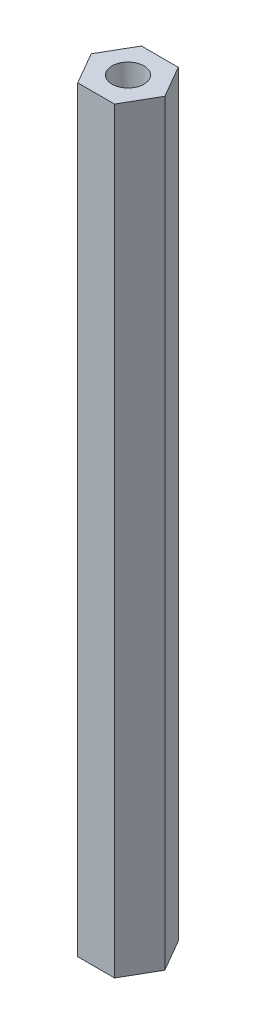
ISO-10303-21;
HEADER;
FILE_DESCRIPTION(('STEP AP214'),'2;1');
FILE_NAME('part.step','',(''),(''),'','','');
FILE_SCHEMA(('AUTOMOTIVE_DESIGN { 1 0 10303 214 1 1 1 1 }'));
ENDSEC;
DATA;
#1=APPLICATION_CONTEXT('core data for automotive mechanical design processes');
#2=APPLICATION_PROTOCOL_DEFINITION('international standard','automotive_design',2000,#1);
#3=PRODUCT_CONTEXT('',#1,'mechanical');
#4=PRODUCT('Part','Part','',(#3));
#5=PRODUCT_RELATED_PRODUCT_CATEGORY('part','',(#4));
#6=PRODUCT_DEFINITION_FORMATION('','',#4);
#7=PRODUCT_DEFINITION_CONTEXT('part definition',#1,'design');
#8=PRODUCT_DEFINITION('design','',#6,#7);
#9=PRODUCT_DEFINITION_SHAPE('','',#8);
#10=(LENGTH_UNIT() NAMED_UNIT(*) SI_UNIT(.MILLI.,.METRE.));
#11=(NAMED_UNIT(*) PLANE_ANGLE_UNIT() SI_UNIT($,.RADIAN.));
#12=(NAMED_UNIT(*) SI_UNIT($,.STERADIAN.) SOLID_ANGLE_UNIT());
#13=UNCERTAINTY_MEASURE_WITH_UNIT(LENGTH_MEASURE(1.E-05),#10,'distance_accuracy_value','');
#14=(GEOMETRIC_REPRESENTATION_CONTEXT(3) GLOBAL_UNCERTAINTY_ASSIGNED_CONTEXT((#13)) GLOBAL_UNIT_ASSIGNED_CONTEXT((#10,
#11,#12)) REPRESENTATION_CONTEXT('',''));
#15=CARTESIAN_POINT('',(0.,0.,0.));
#16=DIRECTION('',(0.,0.,1.));
#17=DIRECTION('',(1.,0.,0.));
#18=AXIS2_PLACEMENT_3D('',#15,#16,#17);
#19=CARTESIAN_POINT('',(4.61880215351701,-47.498,0.));
#20=DIRECTION('',(0.866025403784438,0.,-0.5));
#21=DIRECTION('',(-0.5,0.,-0.866025403784439));
#22=AXIS2_PLACEMENT_3D('',#19,#20,#21);
#23=PLANE('',#22);
#24=DIRECTION('',(0.,1.,0.));
#25=VECTOR('',#24,1.);
#26=CARTESIAN_POINT('',(2.3094010767585,-47.498,-4.));
#27=LINE('',#26,#25);
#28=CARTESIAN_POINT('',(2.3094010767585,-47.498,-4.));
#29=VERTEX_POINT('',#28);
#30=CARTESIAN_POINT('',(2.3094010767585,47.498,-4.));
#31=VERTEX_POINT('',#30);
#32=EDGE_CURVE('E36',#29,#31,#27,.T.);
#33=ORIENTED_EDGE('',*,*,#32,.T.);
#34=DIRECTION('',(-0.5,0.,-0.866025403784439));
#35=VECTOR('',#34,1.);
#36=CARTESIAN_POINT('',(4.61880215351701,47.498,0.));
#37=LINE('',#36,#35);
#38=CARTESIAN_POINT('',(4.61880215351701,47.498,0.));
#39=VERTEX_POINT('',#38);
#40=EDGE_CURVE('E85',#39,#31,#37,.T.);
#41=ORIENTED_EDGE('',*,*,#40,.F.);
#42=DIRECTION('',(0.,1.,0.));
#43=VECTOR('',#42,1.);
#44=CARTESIAN_POINT('',(4.61880215351701,-47.498,0.));
#45=LINE('',#44,#43);
#46=CARTESIAN_POINT('',(4.61880215351701,-47.498,0.));
#47=VERTEX_POINT('',#46);
#48=EDGE_CURVE('E11',#47,#39,#45,.T.);
#49=ORIENTED_EDGE('',*,*,#48,.F.);
#50=DIRECTION('',(-0.5,0.,-0.866025403784439));
#51=VECTOR('',#50,1.);
#52=CARTESIAN_POINT('',(4.61880215351701,-47.498,0.));
#53=LINE('',#52,#51);
#54=EDGE_CURVE('E86',#47,#29,#53,.T.);
#55=ORIENTED_EDGE('',*,*,#54,.T.);
#56=EDGE_LOOP('',(#33,#41,#49,#55));
#57=FACE_BOUND('',#56,.T.);
#58=ADVANCED_FACE('F33',(#57),#23,.T.);
#59=CARTESIAN_POINT('',(2.3094010767585,-47.498,4.));
#60=DIRECTION('',(0.866025403784439,0.,0.5));
#61=DIRECTION('',(0.5,0.,-0.866025403784439));
#62=AXIS2_PLACEMENT_3D('',#59,#60,#61);
#63=PLANE('',#62);
#64=ORIENTED_EDGE('',*,*,#48,.T.);
#65=DIRECTION('',(0.5,0.,-0.866025403784439));
#66=VECTOR('',#65,1.);
#67=CARTESIAN_POINT('',(2.3094010767585,47.498,4.));
#68=LINE('',#67,#66);
#69=CARTESIAN_POINT('',(2.3094010767585,47.498,4.));
#70=VERTEX_POINT('',#69);
#71=EDGE_CURVE('E103',#70,#39,#68,.T.);
#72=ORIENTED_EDGE('',*,*,#71,.F.);
#73=DIRECTION('',(0.,1.,0.));
#74=VECTOR('',#73,1.);
#75=CARTESIAN_POINT('',(2.3094010767585,-47.498,4.));
#76=LINE('',#75,#74);
#77=CARTESIAN_POINT('',(2.3094010767585,-47.498,4.));
#78=VERTEX_POINT('',#77);
#79=EDGE_CURVE('E41',#78,#70,#76,.T.);
#80=ORIENTED_EDGE('',*,*,#79,.F.);
#81=DIRECTION('',(0.5,0.,-0.866025403784439));
#82=VECTOR('',#81,1.);
#83=CARTESIAN_POINT('',(2.3094010767585,-47.498,4.));
#84=LINE('',#83,#82);
#85=EDGE_CURVE('E91',#78,#47,#84,.T.);
#86=ORIENTED_EDGE('',*,*,#85,.T.);
#87=EDGE_LOOP('',(#64,#72,#80,#86));
#88=FACE_BOUND('',#87,.T.);
#89=ADVANCED_FACE('F148',(#88),#63,.T.);
#90=CARTESIAN_POINT('',(-2.3094010767585,-47.498,4.));
#91=DIRECTION('',(0.,0.,1.));
#92=DIRECTION('',(1.,0.,0.));
#93=AXIS2_PLACEMENT_3D('',#90,#91,#92);
#94=PLANE('',#93);
#95=ORIENTED_EDGE('',*,*,#79,.T.);
#96=DIRECTION('',(1.,0.,0.));
#97=VECTOR('',#96,1.);
#98=CARTESIAN_POINT('',(-2.3094010767585,47.498,4.));
#99=LINE('',#98,#97);
#100=CARTESIAN_POINT('',(-2.3094010767585,47.498,4.));
#101=VERTEX_POINT('',#100);
#102=EDGE_CURVE('E115',#101,#70,#99,.T.);
#103=ORIENTED_EDGE('',*,*,#102,.F.);
#104=DIRECTION('',(0.,1.,0.));
#105=VECTOR('',#104,1.);
#106=CARTESIAN_POINT('',(-2.3094010767585,-47.498,4.));
#107=LINE('',#106,#105);
#108=CARTESIAN_POINT('',(-2.3094010767585,-47.498,4.));
#109=VERTEX_POINT('',#108);
#110=EDGE_CURVE('E131',#109,#101,#107,.T.);
#111=ORIENTED_EDGE('',*,*,#110,.F.);
#112=DIRECTION('',(1.,0.,0.));
#113=VECTOR('',#112,1.);
#114=CARTESIAN_POINT('',(-2.3094010767585,-47.498,4.));
#115=LINE('',#114,#113);
#116=EDGE_CURVE('E127',#109,#78,#115,.T.);
#117=ORIENTED_EDGE('',*,*,#116,.T.);
#118=EDGE_LOOP('',(#95,#103,#111,#117));
#119=FACE_BOUND('',#118,.T.);
#120=ADVANCED_FACE('F144',(#119),#94,.T.);
#121=CARTESIAN_POINT('',(-4.61880215351701,-47.498,0.));
#122=DIRECTION('',(-0.866025403784439,0.,0.5));
#123=DIRECTION('',(0.5,0.,0.866025403784439));
#124=AXIS2_PLACEMENT_3D('',#121,#122,#123);
#125=PLANE('',#124);
#126=ORIENTED_EDGE('',*,*,#110,.T.);
#127=DIRECTION('',(0.5,0.,0.866025403784439));
#128=VECTOR('',#127,1.);
#129=CARTESIAN_POINT('',(-4.61880215351701,47.498,0.));
#130=LINE('',#129,#128);
#131=CARTESIAN_POINT('',(-4.61880215351701,47.498,0.));
#132=VERTEX_POINT('',#131);
#133=EDGE_CURVE('E112',#132,#101,#130,.T.);
#134=ORIENTED_EDGE('',*,*,#133,.F.);
#135=DIRECTION('',(0.,1.,0.));
#136=VECTOR('',#135,1.);
#137=CARTESIAN_POINT('',(-4.61880215351701,-47.498,0.));
#138=LINE('',#137,#136);
#139=CARTESIAN_POINT('',(-4.61880215351701,-47.498,0.));
#140=VERTEX_POINT('',#139);
#141=EDGE_CURVE('E133',#140,#132,#138,.T.);
#142=ORIENTED_EDGE('',*,*,#141,.F.);
#143=DIRECTION('',(0.5,0.,0.866025403784439));
#144=VECTOR('',#143,1.);
#145=CARTESIAN_POINT('',(-4.61880215351701,-47.498,0.));
#146=LINE('',#145,#144);
#147=EDGE_CURVE('E124',#140,#109,#146,.T.);
#148=ORIENTED_EDGE('',*,*,#147,.T.);
#149=EDGE_LOOP('',(#126,#134,#142,#148));
#150=FACE_BOUND('',#149,.T.);
#151=ADVANCED_FACE('F141',(#150),#125,.T.);
#152=CARTESIAN_POINT('',(-2.3094010767585,-47.498,-4.));
#153=DIRECTION('',(-0.866025403784438,0.,-0.5));
#154=DIRECTION('',(-0.5,0.,0.866025403784439));
#155=AXIS2_PLACEMENT_3D('',#152,#153,#154);
#156=PLANE('',#155);
#157=ORIENTED_EDGE('',*,*,#141,.T.);
#158=DIRECTION('',(-0.5,0.,0.866025403784439));
#159=VECTOR('',#158,1.);
#160=CARTESIAN_POINT('',(-2.3094010767585,47.498,-4.));
#161=LINE('',#160,#159);
#162=CARTESIAN_POINT('',(-2.3094010767585,47.498,-4.));
#163=VERTEX_POINT('',#162);
#164=EDGE_CURVE('E98',#163,#132,#161,.T.);
#165=ORIENTED_EDGE('',*,*,#164,.F.);
#166=DIRECTION('',(0.,1.,0.));
#167=VECTOR('',#166,1.);
#168=CARTESIAN_POINT('',(-2.3094010767585,-47.498,-4.));
#169=LINE('',#168,#167);
#170=CARTESIAN_POINT('',(-2.3094010767585,-47.498,-4.));
#171=VERTEX_POINT('',#170);
#172=EDGE_CURVE('E90',#171,#163,#169,.T.);
#173=ORIENTED_EDGE('',*,*,#172,.F.);
#174=DIRECTION('',(-0.5,0.,0.866025403784439));
#175=VECTOR('',#174,1.);
#176=CARTESIAN_POINT('',(-2.3094010767585,-47.498,-4.));
#177=LINE('',#176,#175);
#178=EDGE_CURVE('E121',#171,#140,#177,.T.);
#179=ORIENTED_EDGE('',*,*,#178,.T.);
#180=EDGE_LOOP('',(#157,#165,#173,#179));
#181=FACE_BOUND('',#180,.T.);
#182=ADVANCED_FACE('F135',(#181),#156,.T.);
#183=CARTESIAN_POINT('',(2.3094010767585,-47.498,-4.));
#184=DIRECTION('',(0.,0.,-1.));
#185=DIRECTION('',(-1.,0.,0.));
#186=AXIS2_PLACEMENT_3D('',#183,#184,#185);
#187=PLANE('',#186);
#188=ORIENTED_EDGE('',*,*,#172,.T.);
#189=DIRECTION('',(-1.,0.,0.));
#190=VECTOR('',#189,1.);
#191=CARTESIAN_POINT('',(2.3094010767585,47.498,-4.));
#192=LINE('',#191,#190);
#193=EDGE_CURVE('E93',#31,#163,#192,.T.);
#194=ORIENTED_EDGE('',*,*,#193,.F.);
#195=ORIENTED_EDGE('',*,*,#32,.F.);
#196=DIRECTION('',(-1.,0.,0.));
#197=VECTOR('',#196,1.);
#198=CARTESIAN_POINT('',(2.3094010767585,-47.498,-4.));
#199=LINE('',#198,#197);
#200=EDGE_CURVE('E119',#29,#171,#199,.T.);
#201=ORIENTED_EDGE('',*,*,#200,.T.);
#202=EDGE_LOOP('',(#188,#194,#195,#201));
#203=FACE_BOUND('',#202,.T.);
#204=ADVANCED_FACE('F94',(#203),#187,.T.);
#205=CARTESIAN_POINT('',(0.,-47.498,0.));
#206=DIRECTION('',(0.,1.,0.));
#207=DIRECTION('',(0.,0.,1.));
#208=AXIS2_PLACEMENT_3D('',#205,#206,#207);
#209=PLANE('',#208);
#210=CARTESIAN_POINT('',(0.,-47.498,0.));
#211=DIRECTION('',(0.,-1.,0.));
#212=DIRECTION('',(0.,0.,-1.));
#213=AXIS2_PLACEMENT_3D('',#210,#211,#212);
#214=CIRCLE('',#213,2.);
#215=CARTESIAN_POINT('',(0.,-47.498,-2.));
#216=VERTEX_POINT('',#215);
#217=EDGE_CURVE('E107',#216,#216,#214,.T.);
#218=ORIENTED_EDGE('',*,*,#217,.F.);
#219=EDGE_LOOP('',(#218));
#220=FACE_BOUND('',#219,.T.);
#221=ORIENTED_EDGE('',*,*,#54,.F.);
#222=ORIENTED_EDGE('',*,*,#85,.F.);
#223=ORIENTED_EDGE('',*,*,#116,.F.);
#224=ORIENTED_EDGE('',*,*,#147,.F.);
#225=ORIENTED_EDGE('',*,*,#178,.F.);
#226=ORIENTED_EDGE('',*,*,#200,.F.);
#227=EDGE_LOOP('',(#221,#222,#223,#224,#225,#226));
#228=FACE_BOUND('',#227,.T.);
#229=ADVANCED_FACE('F147',(#220,#228),#209,.F.);
#230=CARTESIAN_POINT('',(0.,47.498,0.));
#231=DIRECTION('',(0.,1.,0.));
#232=DIRECTION('',(0.,0.,1.));
#233=AXIS2_PLACEMENT_3D('',#230,#231,#232);
#234=PLANE('',#233);
#235=CARTESIAN_POINT('',(0.,47.498,0.));
#236=DIRECTION('',(0.,1.,0.));
#237=DIRECTION('',(0.,0.,1.));
#238=AXIS2_PLACEMENT_3D('',#235,#236,#237);
#239=CIRCLE('',#238,2.);
#240=CARTESIAN_POINT('',(0.,47.498,2.));
#241=VERTEX_POINT('',#240);
#242=EDGE_CURVE('E177',#241,#241,#239,.T.);
#243=ORIENTED_EDGE('',*,*,#242,.F.);
#244=EDGE_LOOP('',(#243));
#245=FACE_BOUND('',#244,.T.);
#246=ORIENTED_EDGE('',*,*,#40,.T.);
#247=ORIENTED_EDGE('',*,*,#193,.T.);
#248=ORIENTED_EDGE('',*,*,#164,.T.);
#249=ORIENTED_EDGE('',*,*,#133,.T.);
#250=ORIENTED_EDGE('',*,*,#102,.T.);
#251=ORIENTED_EDGE('',*,*,#71,.T.);
#252=EDGE_LOOP('',(#246,#247,#248,#249,#250,#251));
#253=FACE_BOUND('',#252,.T.);
#254=ADVANCED_FACE('F101',(#245,#253),#234,.T.);
#255=CARTESIAN_POINT('',(0.,-36.398,0.));
#256=DIRECTION('',(0.,-1.,0.));
#257=DIRECTION('',(0.,0.,-1.));
#258=AXIS2_PLACEMENT_3D('',#255,#256,#257);
#259=CYLINDRICAL_SURFACE('',#258,2.);
#260=CARTESIAN_POINT('',(0.,-36.398,0.));
#261=DIRECTION('',(0.,-1.,0.));
#262=DIRECTION('',(0.,0.,-1.));
#263=AXIS2_PLACEMENT_3D('',#260,#261,#262);
#264=CIRCLE('',#263,2.);
#265=CARTESIAN_POINT('',(0.,-36.398,-2.));
#266=VERTEX_POINT('',#265);
#267=EDGE_CURVE('E104',#266,#266,#264,.T.);
#268=ORIENTED_EDGE('',*,*,#267,.F.);
#269=EDGE_LOOP('',(#268));
#270=FACE_BOUND('',#269,.T.);
#271=ORIENTED_EDGE('',*,*,#217,.T.);
#272=EDGE_LOOP('',(#271));
#273=FACE_BOUND('',#272,.T.);
#274=ADVANCED_FACE('F170',(#270,#273),#259,.F.);
#275=CARTESIAN_POINT('',(0.,-36.398,0.));
#276=DIRECTION('',(0.,-1.,0.));
#277=DIRECTION('',(0.,0.,-1.));
#278=AXIS2_PLACEMENT_3D('',#275,#276,#277);
#279=PLANE('',#278);
#280=ORIENTED_EDGE('',*,*,#267,.T.);
#281=EDGE_LOOP('',(#280));
#282=FACE_BOUND('',#281,.T.);
#283=ADVANCED_FACE('F188',(#282),#279,.T.);
#284=CARTESIAN_POINT('',(0.,37.498,0.));
#285=DIRECTION('',(0.,1.,0.));
#286=DIRECTION('',(0.,0.,1.));
#287=AXIS2_PLACEMENT_3D('',#284,#285,#286);
#288=CYLINDRICAL_SURFACE('',#287,2.);
#289=CARTESIAN_POINT('',(0.,37.498,0.));
#290=DIRECTION('',(0.,1.,0.));
#291=DIRECTION('',(0.,0.,1.));
#292=AXIS2_PLACEMENT_3D('',#289,#290,#291);
#293=CIRCLE('',#292,2.);
#294=CARTESIAN_POINT('',(0.,37.498,2.));
#295=VERTEX_POINT('',#294);
#296=EDGE_CURVE('E175',#295,#295,#293,.T.);
#297=ORIENTED_EDGE('',*,*,#296,.F.);
#298=EDGE_LOOP('',(#297));
#299=FACE_BOUND('',#298,.T.);
#300=ORIENTED_EDGE('',*,*,#242,.T.);
#301=EDGE_LOOP('',(#300));
#302=FACE_BOUND('',#301,.T.);
#303=ADVANCED_FACE('F185',(#299,#302),#288,.F.);
#304=CARTESIAN_POINT('',(0.,37.498,0.));
#305=DIRECTION('',(0.,1.,0.));
#306=DIRECTION('',(0.,0.,1.));
#307=AXIS2_PLACEMENT_3D('',#304,#305,#306);
#308=PLANE('',#307);
#309=ORIENTED_EDGE('',*,*,#296,.T.);
#310=EDGE_LOOP('',(#309));
#311=FACE_BOUND('',#310,.T.);
#312=ADVANCED_FACE('F187',(#311),#308,.T.);
#313=CLOSED_SHELL('',(#58,#89,#120,#151,#182,#204,#229,#254,#274,#283,#303,#312));
#314=MANIFOLD_SOLID_BREP('B2',#313);
#315=ADVANCED_BREP_SHAPE_REPRESENTATION('',(#18,#314),#14);
#316=SHAPE_DEFINITION_REPRESENTATION(#9,#315);
ENDSEC;
END-ISO-10303-21;
